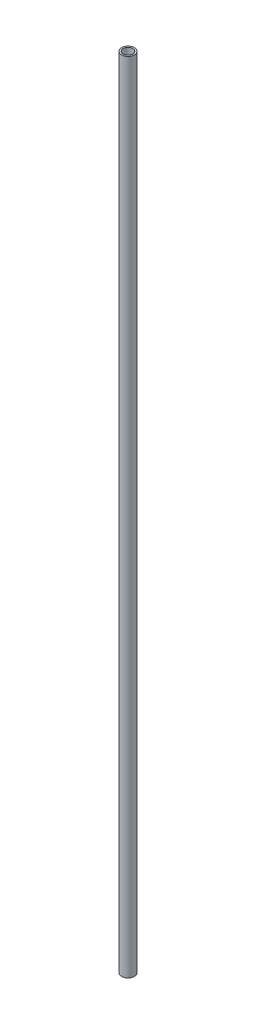
ISO-10303-21;
HEADER;
FILE_DESCRIPTION(('STEP AP214'),'2;1');
FILE_NAME('part.step','',(''),(''),'','','');
FILE_SCHEMA(('AUTOMOTIVE_DESIGN { 1 0 10303 214 1 1 1 1 }'));
ENDSEC;
DATA;
#1=APPLICATION_CONTEXT('core data for automotive mechanical design processes');
#2=APPLICATION_PROTOCOL_DEFINITION('international standard','automotive_design',2000,#1);
#3=PRODUCT_CONTEXT('',#1,'mechanical');
#4=PRODUCT('Part','Part','',(#3));
#5=PRODUCT_RELATED_PRODUCT_CATEGORY('part','',(#4));
#6=PRODUCT_DEFINITION_FORMATION('','',#4);
#7=PRODUCT_DEFINITION_CONTEXT('part definition',#1,'design');
#8=PRODUCT_DEFINITION('design','',#6,#7);
#9=PRODUCT_DEFINITION_SHAPE('','',#8);
#10=(LENGTH_UNIT() NAMED_UNIT(*) SI_UNIT(.MILLI.,.METRE.));
#11=(NAMED_UNIT(*) PLANE_ANGLE_UNIT() SI_UNIT($,.RADIAN.));
#12=(NAMED_UNIT(*) SI_UNIT($,.STERADIAN.) SOLID_ANGLE_UNIT());
#13=UNCERTAINTY_MEASURE_WITH_UNIT(LENGTH_MEASURE(1.E-05),#10,'distance_accuracy_value','');
#14=(GEOMETRIC_REPRESENTATION_CONTEXT(3) GLOBAL_UNCERTAINTY_ASSIGNED_CONTEXT((#13)) GLOBAL_UNIT_ASSIGNED_CONTEXT((#10,
#11,#12)) REPRESENTATION_CONTEXT('',''));
#15=CARTESIAN_POINT('',(0.,0.,0.));
#16=DIRECTION('',(0.,0.,1.));
#17=DIRECTION('',(1.,0.,0.));
#18=AXIS2_PLACEMENT_3D('',#15,#16,#17);
#19=CARTESIAN_POINT('',(0.,250.,0.));
#20=DIRECTION('',(0.,1.,0.));
#21=DIRECTION('',(0.,0.,1.));
#22=AXIS2_PLACEMENT_3D('',#19,#20,#21);
#23=PLANE('',#22);
#24=CARTESIAN_POINT('',(0.,250.,0.));
#25=DIRECTION('',(0.,1.,0.));
#26=DIRECTION('',(0.,0.,1.));
#27=AXIS2_PLACEMENT_3D('',#24,#25,#26);
#28=CIRCLE('',#27,2.);
#29=CARTESIAN_POINT('',(0.,250.,2.));
#30=VERTEX_POINT('',#29);
#31=EDGE_CURVE('E10',#30,#30,#28,.T.);
#32=ORIENTED_EDGE('',*,*,#31,.T.);
#33=EDGE_LOOP('',(#32));
#34=FACE_BOUND('',#33,.T.);
#35=CARTESIAN_POINT('',(0.,250.,0.));
#36=DIRECTION('',(0.,1.,0.));
#37=DIRECTION('',(0.,0.,1.));
#38=AXIS2_PLACEMENT_3D('',#35,#36,#37);
#39=CIRCLE('',#38,1.5);
#40=CARTESIAN_POINT('',(0.,250.,1.5));
#41=VERTEX_POINT('',#40);
#42=EDGE_CURVE('E44',#41,#41,#39,.T.);
#43=ORIENTED_EDGE('',*,*,#42,.F.);
#44=EDGE_LOOP('',(#43));
#45=FACE_BOUND('',#44,.T.);
#46=ADVANCED_FACE('F33',(#34,#45),#23,.T.);
#47=CARTESIAN_POINT('',(0.,0.,0.));
#48=DIRECTION('',(0.,1.,0.));
#49=DIRECTION('',(0.,0.,1.));
#50=AXIS2_PLACEMENT_3D('',#47,#48,#49);
#51=PLANE('',#50);
#52=CARTESIAN_POINT('',(0.,0.,0.));
#53=DIRECTION('',(0.,1.,0.));
#54=DIRECTION('',(0.,0.,1.));
#55=AXIS2_PLACEMENT_3D('',#52,#53,#54);
#56=CIRCLE('',#55,2.);
#57=CARTESIAN_POINT('',(0.,0.,2.));
#58=VERTEX_POINT('',#57);
#59=EDGE_CURVE('E37',#58,#58,#56,.T.);
#60=ORIENTED_EDGE('',*,*,#59,.F.);
#61=EDGE_LOOP('',(#60));
#62=FACE_BOUND('',#61,.T.);
#63=CARTESIAN_POINT('',(0.,0.,0.));
#64=DIRECTION('',(0.,1.,0.));
#65=DIRECTION('',(0.,0.,1.));
#66=AXIS2_PLACEMENT_3D('',#63,#64,#65);
#67=CIRCLE('',#66,1.5);
#68=CARTESIAN_POINT('',(0.,0.,1.5));
#69=VERTEX_POINT('',#68);
#70=EDGE_CURVE('E46',#69,#69,#67,.T.);
#71=ORIENTED_EDGE('',*,*,#70,.T.);
#72=EDGE_LOOP('',(#71));
#73=FACE_BOUND('',#72,.T.);
#74=ADVANCED_FACE('F56',(#62,#73),#51,.F.);
#75=CARTESIAN_POINT('',(0.,250.,0.));
#76=DIRECTION('',(0.,-1.,0.));
#77=DIRECTION('',(0.,0.,-1.));
#78=AXIS2_PLACEMENT_3D('',#75,#76,#77);
#79=CYLINDRICAL_SURFACE('',#78,2.);
#80=ORIENTED_EDGE('',*,*,#31,.F.);
#81=EDGE_LOOP('',(#80));
#82=FACE_BOUND('',#81,.T.);
#83=ORIENTED_EDGE('',*,*,#59,.T.);
#84=EDGE_LOOP('',(#83));
#85=FACE_BOUND('',#84,.T.);
#86=ADVANCED_FACE('F35',(#82,#85),#79,.T.);
#87=CARTESIAN_POINT('',(0.,250.,0.));
#88=DIRECTION('',(0.,-1.,0.));
#89=DIRECTION('',(0.,0.,-1.));
#90=AXIS2_PLACEMENT_3D('',#87,#88,#89);
#91=CYLINDRICAL_SURFACE('',#90,1.5);
#92=ORIENTED_EDGE('',*,*,#42,.T.);
#93=EDGE_LOOP('',(#92));
#94=FACE_BOUND('',#93,.T.);
#95=ORIENTED_EDGE('',*,*,#70,.F.);
#96=EDGE_LOOP('',(#95));
#97=FACE_BOUND('',#96,.T.);
#98=ADVANCED_FACE('F52',(#94,#97),#91,.F.);
#99=CLOSED_SHELL('',(#46,#74,#86,#98));
#100=MANIFOLD_SOLID_BREP('B2',#99);
#101=ADVANCED_BREP_SHAPE_REPRESENTATION('',(#18,#100),#14);
#102=SHAPE_DEFINITION_REPRESENTATION(#9,#101);
ENDSEC;
END-ISO-10303-21;
